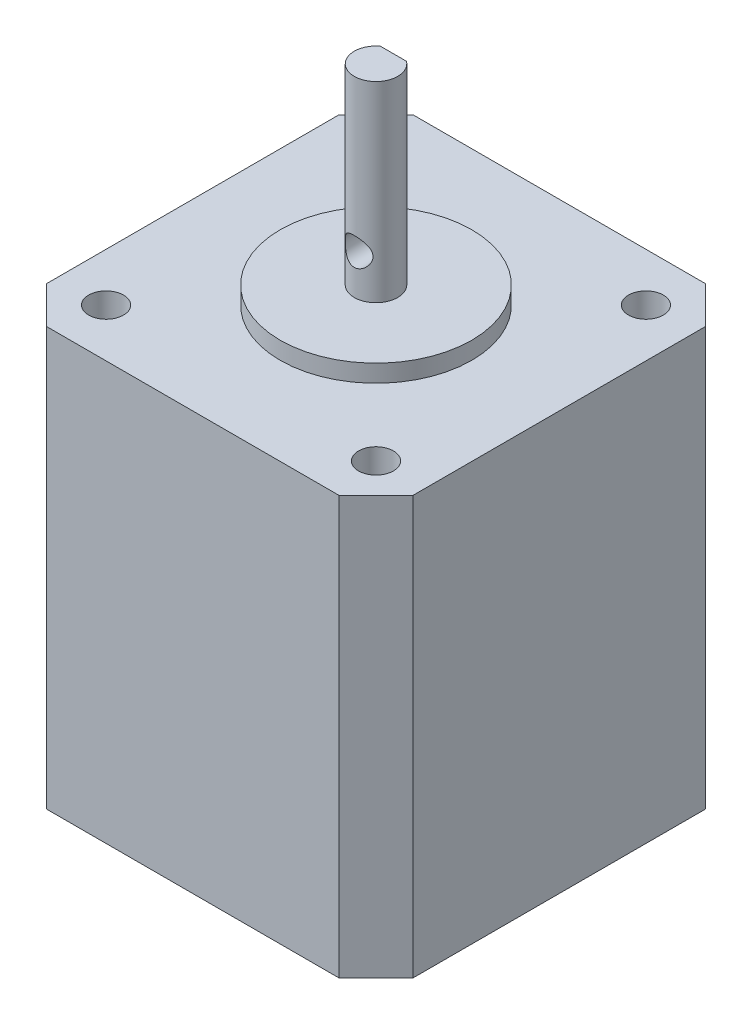
ISO-10303-21;
HEADER;
FILE_DESCRIPTION(('STEP AP214'),'2;1');
FILE_NAME('part.step','',(''),(''),'','','');
FILE_SCHEMA(('AUTOMOTIVE_DESIGN { 1 0 10303 214 1 1 1 1 }'));
ENDSEC;
DATA;
#1=APPLICATION_CONTEXT('core data for automotive mechanical design processes');
#2=APPLICATION_PROTOCOL_DEFINITION('international standard','automotive_design',2000,#1);
#3=PRODUCT_CONTEXT('',#1,'mechanical');
#4=PRODUCT('Part','Part','',(#3));
#5=PRODUCT_RELATED_PRODUCT_CATEGORY('part','',(#4));
#6=PRODUCT_DEFINITION_FORMATION('','',#4);
#7=PRODUCT_DEFINITION_CONTEXT('part definition',#1,'design');
#8=PRODUCT_DEFINITION('design','',#6,#7);
#9=PRODUCT_DEFINITION_SHAPE('','',#8);
#10=(LENGTH_UNIT() NAMED_UNIT(*) SI_UNIT(.MILLI.,.METRE.));
#11=(NAMED_UNIT(*) PLANE_ANGLE_UNIT() SI_UNIT($,.RADIAN.));
#12=(NAMED_UNIT(*) SI_UNIT($,.STERADIAN.) SOLID_ANGLE_UNIT());
#13=UNCERTAINTY_MEASURE_WITH_UNIT(LENGTH_MEASURE(1.E-05),#10,'distance_accuracy_value','');
#14=(GEOMETRIC_REPRESENTATION_CONTEXT(3) GLOBAL_UNCERTAINTY_ASSIGNED_CONTEXT((#13)) GLOBAL_UNIT_ASSIGNED_CONTEXT((#10,
#11,#12)) REPRESENTATION_CONTEXT('',''));
#15=CARTESIAN_POINT('',(0.,0.,0.));
#16=DIRECTION('',(0.,0.,1.));
#17=DIRECTION('',(1.,0.,0.));
#18=AXIS2_PLACEMENT_3D('',#15,#16,#17);
#19=CARTESIAN_POINT('',(-16.8073593128807,48.,-21.05));
#20=DIRECTION('',(0.707106781186548,0.,0.707106781186547));
#21=DIRECTION('',(0.707106781186547,0.,-0.707106781186548));
#22=AXIS2_PLACEMENT_3D('',#19,#20,#21);
#23=PLANE('',#22);
#24=DIRECTION('',(-0.707106781186547,0.,0.707106781186548));
#25=VECTOR('',#24,1.);
#26=CARTESIAN_POINT('',(-16.8073593128807,0.,-21.05));
#27=LINE('',#26,#25);
#28=CARTESIAN_POINT('',(-16.8073593128807,0.,-21.05));
#29=VERTEX_POINT('',#28);
#30=CARTESIAN_POINT('',(-21.05,0.,-16.8073593128807));
#31=VERTEX_POINT('',#30);
#32=EDGE_CURVE('E154',#29,#31,#27,.T.);
#33=ORIENTED_EDGE('',*,*,#32,.T.);
#34=DIRECTION('',(0.,-1.,0.));
#35=VECTOR('',#34,1.);
#36=CARTESIAN_POINT('',(-21.05,48.,-16.8073593128807));
#37=LINE('',#36,#35);
#38=CARTESIAN_POINT('',(-21.05,48.,-16.8073593128807));
#39=VERTEX_POINT('',#38);
#40=EDGE_CURVE('E185',#39,#31,#37,.T.);
#41=ORIENTED_EDGE('',*,*,#40,.F.);
#42=DIRECTION('',(-0.707106781186547,0.,0.707106781186548));
#43=VECTOR('',#42,1.);
#44=CARTESIAN_POINT('',(-16.8073593128807,48.,-21.05));
#45=LINE('',#44,#43);
#46=CARTESIAN_POINT('',(-16.8073593128807,48.,-21.05));
#47=VERTEX_POINT('',#46);
#48=EDGE_CURVE('E174',#47,#39,#45,.T.);
#49=ORIENTED_EDGE('',*,*,#48,.F.);
#50=DIRECTION('',(0.,-1.,0.));
#51=VECTOR('',#50,1.);
#52=CARTESIAN_POINT('',(-16.8073593128807,48.,-21.05));
#53=LINE('',#52,#51);
#54=EDGE_CURVE('E67',#47,#29,#53,.T.);
#55=ORIENTED_EDGE('',*,*,#54,.T.);
#56=EDGE_LOOP('',(#33,#41,#49,#55));
#57=FACE_BOUND('',#56,.T.);
#58=ADVANCED_FACE('F38',(#57),#23,.F.);
#59=CARTESIAN_POINT('',(-21.05,48.,-16.8073593128807));
#60=DIRECTION('',(1.,0.,0.));
#61=DIRECTION('',(0.,0.,-1.));
#62=AXIS2_PLACEMENT_3D('',#59,#60,#61);
#63=PLANE('',#62);
#64=DIRECTION('',(0.,0.,1.));
#65=VECTOR('',#64,1.);
#66=CARTESIAN_POINT('',(-21.05,0.,-16.8073593128807));
#67=LINE('',#66,#65);
#68=CARTESIAN_POINT('',(-21.05,0.,16.8073593128807));
#69=VERTEX_POINT('',#68);
#70=EDGE_CURVE('E156',#31,#69,#67,.T.);
#71=ORIENTED_EDGE('',*,*,#70,.T.);
#72=DIRECTION('',(0.,-1.,0.));
#73=VECTOR('',#72,1.);
#74=CARTESIAN_POINT('',(-21.05,48.,16.8073593128807));
#75=LINE('',#74,#73);
#76=CARTESIAN_POINT('',(-21.05,48.,16.8073593128807));
#77=VERTEX_POINT('',#76);
#78=EDGE_CURVE('E183',#77,#69,#75,.T.);
#79=ORIENTED_EDGE('',*,*,#78,.F.);
#80=DIRECTION('',(0.,0.,1.));
#81=VECTOR('',#80,1.);
#82=CARTESIAN_POINT('',(-21.05,48.,-16.8073593128807));
#83=LINE('',#82,#81);
#84=EDGE_CURVE('E107',#39,#77,#83,.T.);
#85=ORIENTED_EDGE('',*,*,#84,.F.);
#86=ORIENTED_EDGE('',*,*,#40,.T.);
#87=EDGE_LOOP('',(#71,#79,#85,#86));
#88=FACE_BOUND('',#87,.T.);
#89=ADVANCED_FACE('F220',(#88),#63,.F.);
#90=CARTESIAN_POINT('',(-16.8073593128807,48.,21.05));
#91=DIRECTION('',(-0.707106781186548,0.,0.707106781186547));
#92=DIRECTION('',(0.707106781186547,0.,0.707106781186548));
#93=AXIS2_PLACEMENT_3D('',#90,#91,#92);
#94=PLANE('',#93);
#95=DIRECTION('',(-0.707106781186547,0.,-0.707106781186548));
#96=VECTOR('',#95,1.);
#97=CARTESIAN_POINT('',(-16.8073593128807,0.,21.05));
#98=LINE('',#97,#96);
#99=CARTESIAN_POINT('',(-16.8073593128807,0.,21.05));
#100=VERTEX_POINT('',#99);
#101=EDGE_CURVE('E160',#100,#69,#98,.T.);
#102=ORIENTED_EDGE('',*,*,#101,.F.);
#103=DIRECTION('',(0.,-1.,0.));
#104=VECTOR('',#103,1.);
#105=CARTESIAN_POINT('',(-16.8073593128807,48.,21.05));
#106=LINE('',#105,#104);
#107=CARTESIAN_POINT('',(-16.8073593128807,48.,21.05));
#108=VERTEX_POINT('',#107);
#109=EDGE_CURVE('E181',#108,#100,#106,.T.);
#110=ORIENTED_EDGE('',*,*,#109,.F.);
#111=DIRECTION('',(-0.707106781186547,0.,-0.707106781186548));
#112=VECTOR('',#111,1.);
#113=CARTESIAN_POINT('',(-16.8073593128807,48.,21.05));
#114=LINE('',#113,#112);
#115=EDGE_CURVE('E242',#108,#77,#114,.T.);
#116=ORIENTED_EDGE('',*,*,#115,.T.);
#117=ORIENTED_EDGE('',*,*,#78,.T.);
#118=EDGE_LOOP('',(#102,#110,#116,#117));
#119=FACE_BOUND('',#118,.T.);
#120=ADVANCED_FACE('F224',(#119),#94,.T.);
#121=CARTESIAN_POINT('',(-16.8073593128807,48.,21.05));
#122=DIRECTION('',(0.,0.,-1.));
#123=DIRECTION('',(-1.,0.,0.));
#124=AXIS2_PLACEMENT_3D('',#121,#122,#123);
#125=PLANE('',#124);
#126=DIRECTION('',(1.,0.,0.));
#127=VECTOR('',#126,1.);
#128=CARTESIAN_POINT('',(-16.8073593128807,0.,21.05));
#129=LINE('',#128,#127);
#130=CARTESIAN_POINT('',(16.8073593128807,0.,21.05));
#131=VERTEX_POINT('',#130);
#132=EDGE_CURVE('E163',#100,#131,#129,.T.);
#133=ORIENTED_EDGE('',*,*,#132,.T.);
#134=DIRECTION('',(0.,-1.,0.));
#135=VECTOR('',#134,1.);
#136=CARTESIAN_POINT('',(16.8073593128807,48.,21.05));
#137=LINE('',#136,#135);
#138=CARTESIAN_POINT('',(16.8073593128807,48.,21.05));
#139=VERTEX_POINT('',#138);
#140=EDGE_CURVE('E178',#139,#131,#137,.T.);
#141=ORIENTED_EDGE('',*,*,#140,.F.);
#142=DIRECTION('',(1.,0.,0.));
#143=VECTOR('',#142,1.);
#144=CARTESIAN_POINT('',(-16.8073593128807,48.,21.05));
#145=LINE('',#144,#143);
#146=EDGE_CURVE('E238',#108,#139,#145,.T.);
#147=ORIENTED_EDGE('',*,*,#146,.F.);
#148=ORIENTED_EDGE('',*,*,#109,.T.);
#149=EDGE_LOOP('',(#133,#141,#147,#148));
#150=FACE_BOUND('',#149,.T.);
#151=ADVANCED_FACE('F237',(#150),#125,.F.);
#152=CARTESIAN_POINT('',(16.8073593128807,48.,21.05));
#153=DIRECTION('',(-0.707106781186548,0.,-0.707106781186547));
#154=DIRECTION('',(-0.707106781186547,0.,0.707106781186548));
#155=AXIS2_PLACEMENT_3D('',#152,#153,#154);
#156=PLANE('',#155);
#157=DIRECTION('',(0.707106781186547,0.,-0.707106781186548));
#158=VECTOR('',#157,1.);
#159=CARTESIAN_POINT('',(16.8073593128807,0.,21.05));
#160=LINE('',#159,#158);
#161=CARTESIAN_POINT('',(21.05,0.,16.8073593128807));
#162=VERTEX_POINT('',#161);
#163=EDGE_CURVE('E165',#131,#162,#160,.T.);
#164=ORIENTED_EDGE('',*,*,#163,.T.);
#165=DIRECTION('',(0.,-1.,0.));
#166=VECTOR('',#165,1.);
#167=CARTESIAN_POINT('',(21.05,48.,16.8073593128807));
#168=LINE('',#167,#166);
#169=CARTESIAN_POINT('',(21.05,48.,16.8073593128807));
#170=VERTEX_POINT('',#169);
#171=EDGE_CURVE('E136',#170,#162,#168,.T.);
#172=ORIENTED_EDGE('',*,*,#171,.F.);
#173=DIRECTION('',(0.707106781186547,0.,-0.707106781186548));
#174=VECTOR('',#173,1.);
#175=CARTESIAN_POINT('',(16.8073593128807,48.,21.05));
#176=LINE('',#175,#174);
#177=EDGE_CURVE('E145',#139,#170,#176,.T.);
#178=ORIENTED_EDGE('',*,*,#177,.F.);
#179=ORIENTED_EDGE('',*,*,#140,.T.);
#180=EDGE_LOOP('',(#164,#172,#178,#179));
#181=FACE_BOUND('',#180,.T.);
#182=ADVANCED_FACE('F233',(#181),#156,.F.);
#183=CARTESIAN_POINT('',(21.05,48.,-16.8073593128807));
#184=DIRECTION('',(1.,0.,0.));
#185=DIRECTION('',(0.,0.,-1.));
#186=AXIS2_PLACEMENT_3D('',#183,#184,#185);
#187=PLANE('',#186);
#188=DIRECTION('',(0.,0.,1.));
#189=VECTOR('',#188,1.);
#190=CARTESIAN_POINT('',(21.05,0.,-16.8073593128807));
#191=LINE('',#190,#189);
#192=CARTESIAN_POINT('',(21.05,0.,-16.8073593128807));
#193=VERTEX_POINT('',#192);
#194=EDGE_CURVE('E131',#193,#162,#191,.T.);
#195=ORIENTED_EDGE('',*,*,#194,.F.);
#196=DIRECTION('',(0.,-1.,0.));
#197=VECTOR('',#196,1.);
#198=CARTESIAN_POINT('',(21.05,48.,-16.8073593128807));
#199=LINE('',#198,#197);
#200=CARTESIAN_POINT('',(21.05,48.,-16.8073593128807));
#201=VERTEX_POINT('',#200);
#202=EDGE_CURVE('E126',#201,#193,#199,.T.);
#203=ORIENTED_EDGE('',*,*,#202,.F.);
#204=DIRECTION('',(0.,0.,1.));
#205=VECTOR('',#204,1.);
#206=CARTESIAN_POINT('',(21.05,48.,-16.8073593128807));
#207=LINE('',#206,#205);
#208=EDGE_CURVE('E129',#201,#170,#207,.T.);
#209=ORIENTED_EDGE('',*,*,#208,.T.);
#210=ORIENTED_EDGE('',*,*,#171,.T.);
#211=EDGE_LOOP('',(#195,#203,#209,#210));
#212=FACE_BOUND('',#211,.T.);
#213=ADVANCED_FACE('F128',(#212),#187,.T.);
#214=CARTESIAN_POINT('',(16.8073593128807,48.,-21.05));
#215=DIRECTION('',(0.707106781186548,0.,-0.707106781186547));
#216=DIRECTION('',(-0.707106781186547,0.,-0.707106781186548));
#217=AXIS2_PLACEMENT_3D('',#214,#215,#216);
#218=PLANE('',#217);
#219=DIRECTION('',(0.707106781186547,0.,0.707106781186548));
#220=VECTOR('',#219,1.);
#221=CARTESIAN_POINT('',(16.8073593128807,0.,-21.05));
#222=LINE('',#221,#220);
#223=CARTESIAN_POINT('',(16.8073593128807,0.,-21.05));
#224=VERTEX_POINT('',#223);
#225=EDGE_CURVE('E169',#224,#193,#222,.T.);
#226=ORIENTED_EDGE('',*,*,#225,.F.);
#227=DIRECTION('',(0.,-1.,0.));
#228=VECTOR('',#227,1.);
#229=CARTESIAN_POINT('',(16.8073593128807,48.,-21.05));
#230=LINE('',#229,#228);
#231=CARTESIAN_POINT('',(16.8073593128807,48.,-21.05));
#232=VERTEX_POINT('',#231);
#233=EDGE_CURVE('E137',#232,#224,#230,.T.);
#234=ORIENTED_EDGE('',*,*,#233,.F.);
#235=DIRECTION('',(0.707106781186547,0.,0.707106781186548));
#236=VECTOR('',#235,1.);
#237=CARTESIAN_POINT('',(16.8073593128807,48.,-21.05));
#238=LINE('',#237,#236);
#239=EDGE_CURVE('E143',#232,#201,#238,.T.);
#240=ORIENTED_EDGE('',*,*,#239,.T.);
#241=ORIENTED_EDGE('',*,*,#202,.T.);
#242=EDGE_LOOP('',(#226,#234,#240,#241));
#243=FACE_BOUND('',#242,.T.);
#244=ADVANCED_FACE('F148',(#243),#218,.T.);
#245=CARTESIAN_POINT('',(-16.8073593128807,48.,-21.05));
#246=DIRECTION('',(0.,0.,-1.));
#247=DIRECTION('',(-1.,0.,0.));
#248=AXIS2_PLACEMENT_3D('',#245,#246,#247);
#249=PLANE('',#248);
#250=DIRECTION('',(1.,0.,0.));
#251=VECTOR('',#250,1.);
#252=CARTESIAN_POINT('',(-16.8073593128807,0.,-21.05));
#253=LINE('',#252,#251);
#254=EDGE_CURVE('E171',#29,#224,#253,.T.);
#255=ORIENTED_EDGE('',*,*,#254,.F.);
#256=ORIENTED_EDGE('',*,*,#54,.F.);
#257=DIRECTION('',(1.,0.,0.));
#258=VECTOR('',#257,1.);
#259=CARTESIAN_POINT('',(-16.8073593128807,48.,-21.05));
#260=LINE('',#259,#258);
#261=EDGE_CURVE('E149',#47,#232,#260,.T.);
#262=ORIENTED_EDGE('',*,*,#261,.T.);
#263=ORIENTED_EDGE('',*,*,#233,.T.);
#264=EDGE_LOOP('',(#255,#256,#262,#263));
#265=FACE_BOUND('',#264,.T.);
#266=ADVANCED_FACE('F228',(#265),#249,.T.);
#267=CARTESIAN_POINT('',(0.,48.,0.));
#268=DIRECTION('',(0.,-1.,0.));
#269=DIRECTION('',(0.,0.,-1.));
#270=AXIS2_PLACEMENT_3D('',#267,#268,#269);
#271=PLANE('',#270);
#272=CARTESIAN_POINT('',(0.,48.,0.));
#273=DIRECTION('',(0.,-1.,0.));
#274=DIRECTION('',(0.,0.,-1.));
#275=AXIS2_PLACEMENT_3D('',#272,#273,#274);
#276=CIRCLE('',#275,11.);
#277=CARTESIAN_POINT('',(0.,48.,-11.));
#278=VERTEX_POINT('',#277);
#279=EDGE_CURVE('E187',#278,#278,#276,.F.);
#280=ORIENTED_EDGE('',*,*,#279,.F.);
#281=EDGE_LOOP('',(#280));
#282=FACE_BOUND('',#281,.T.);
#283=CARTESIAN_POINT('',(-15.5,48.,15.5));
#284=DIRECTION('',(0.,1.,0.));
#285=DIRECTION('',(0.,0.,-1.));
#286=AXIS2_PLACEMENT_3D('',#283,#284,#285);
#287=CIRCLE('',#286,2.);
#288=CARTESIAN_POINT('',(-15.5,48.,13.5));
#289=VERTEX_POINT('',#288);
#290=EDGE_CURVE('E258',#289,#289,#287,.T.);
#291=ORIENTED_EDGE('',*,*,#290,.F.);
#292=EDGE_LOOP('',(#291));
#293=FACE_BOUND('',#292,.T.);
#294=CARTESIAN_POINT('',(15.5,48.,15.5));
#295=DIRECTION('',(0.,1.,0.));
#296=DIRECTION('',(0.,0.,1.));
#297=AXIS2_PLACEMENT_3D('',#294,#295,#296);
#298=CIRCLE('',#297,2.);
#299=CARTESIAN_POINT('',(15.5,48.,17.5));
#300=VERTEX_POINT('',#299);
#301=EDGE_CURVE('E257',#300,#300,#298,.T.);
#302=ORIENTED_EDGE('',*,*,#301,.F.);
#303=EDGE_LOOP('',(#302));
#304=FACE_BOUND('',#303,.T.);
#305=CARTESIAN_POINT('',(15.5,48.,-15.5));
#306=DIRECTION('',(0.,1.,0.));
#307=DIRECTION('',(0.,0.,-1.));
#308=AXIS2_PLACEMENT_3D('',#305,#306,#307);
#309=CIRCLE('',#308,2.);
#310=CARTESIAN_POINT('',(15.5,48.,-17.5));
#311=VERTEX_POINT('',#310);
#312=EDGE_CURVE('E265',#311,#311,#309,.T.);
#313=ORIENTED_EDGE('',*,*,#312,.F.);
#314=EDGE_LOOP('',(#313));
#315=FACE_BOUND('',#314,.T.);
#316=CARTESIAN_POINT('',(-15.5,48.,-15.5));
#317=DIRECTION('',(0.,1.,0.));
#318=DIRECTION('',(0.,0.,1.));
#319=AXIS2_PLACEMENT_3D('',#316,#317,#318);
#320=CIRCLE('',#319,2.);
#321=CARTESIAN_POINT('',(-15.5,48.,-13.5));
#322=VERTEX_POINT('',#321);
#323=EDGE_CURVE('E250',#322,#322,#320,.T.);
#324=ORIENTED_EDGE('',*,*,#323,.F.);
#325=EDGE_LOOP('',(#324));
#326=FACE_BOUND('',#325,.T.);
#327=ORIENTED_EDGE('',*,*,#48,.T.);
#328=ORIENTED_EDGE('',*,*,#84,.T.);
#329=ORIENTED_EDGE('',*,*,#115,.F.);
#330=ORIENTED_EDGE('',*,*,#146,.T.);
#331=ORIENTED_EDGE('',*,*,#177,.T.);
#332=ORIENTED_EDGE('',*,*,#208,.F.);
#333=ORIENTED_EDGE('',*,*,#239,.F.);
#334=ORIENTED_EDGE('',*,*,#261,.F.);
#335=EDGE_LOOP('',(#327,#328,#329,#330,#331,#332,#333,#334));
#336=FACE_BOUND('',#335,.T.);
#337=ADVANCED_FACE('F141',(#282,#293,#304,#315,#326,#336),#271,.F.);
#338=CARTESIAN_POINT('',(0.,0.,0.));
#339=DIRECTION('',(0.,-1.,0.));
#340=DIRECTION('',(0.,0.,-1.));
#341=AXIS2_PLACEMENT_3D('',#338,#339,#340);
#342=PLANE('',#341);
#343=CARTESIAN_POINT('',(0.,0.,0.));
#344=DIRECTION('',(0.,-1.,0.));
#345=DIRECTION('',(0.,0.,-1.));
#346=AXIS2_PLACEMENT_3D('',#343,#344,#345);
#347=CIRCLE('',#346,2.5);
#348=CARTESIAN_POINT('',(0.,0.,-2.5));
#349=VERTEX_POINT('',#348);
#350=EDGE_CURVE('E291',#349,#349,#347,.T.);
#351=ORIENTED_EDGE('',*,*,#350,.F.);
#352=EDGE_LOOP('',(#351));
#353=FACE_BOUND('',#352,.T.);
#354=CARTESIAN_POINT('',(-15.5,0.,15.5));
#355=DIRECTION('',(0.,-1.,0.));
#356=DIRECTION('',(0.,0.,-1.));
#357=AXIS2_PLACEMENT_3D('',#354,#355,#356);
#358=CIRCLE('',#357,2.);
#359=CARTESIAN_POINT('',(-15.5,0.,13.5));
#360=VERTEX_POINT('',#359);
#361=EDGE_CURVE('E254',#360,#360,#358,.F.);
#362=ORIENTED_EDGE('',*,*,#361,.T.);
#363=EDGE_LOOP('',(#362));
#364=FACE_BOUND('',#363,.T.);
#365=CARTESIAN_POINT('',(15.5,0.,15.5));
#366=DIRECTION('',(0.,-1.,0.));
#367=DIRECTION('',(0.,0.,-1.));
#368=AXIS2_PLACEMENT_3D('',#365,#366,#367);
#369=CIRCLE('',#368,2.);
#370=CARTESIAN_POINT('',(15.5,0.,13.5));
#371=VERTEX_POINT('',#370);
#372=EDGE_CURVE('E262',#371,#371,#369,.F.);
#373=ORIENTED_EDGE('',*,*,#372,.T.);
#374=EDGE_LOOP('',(#373));
#375=FACE_BOUND('',#374,.T.);
#376=CARTESIAN_POINT('',(15.5,0.,-15.5));
#377=DIRECTION('',(0.,-1.,0.));
#378=DIRECTION('',(0.,0.,-1.));
#379=AXIS2_PLACEMENT_3D('',#376,#377,#378);
#380=CIRCLE('',#379,2.);
#381=CARTESIAN_POINT('',(15.5,0.,-17.5));
#382=VERTEX_POINT('',#381);
#383=EDGE_CURVE('E253',#382,#382,#380,.F.);
#384=ORIENTED_EDGE('',*,*,#383,.T.);
#385=EDGE_LOOP('',(#384));
#386=FACE_BOUND('',#385,.T.);
#387=CARTESIAN_POINT('',(-15.5,0.,-15.5));
#388=DIRECTION('',(0.,-1.,0.));
#389=DIRECTION('',(0.,0.,-1.));
#390=AXIS2_PLACEMENT_3D('',#387,#388,#389);
#391=CIRCLE('',#390,2.);
#392=CARTESIAN_POINT('',(-15.5,0.,-17.5));
#393=VERTEX_POINT('',#392);
#394=EDGE_CURVE('E157',#393,#393,#391,.F.);
#395=ORIENTED_EDGE('',*,*,#394,.T.);
#396=EDGE_LOOP('',(#395));
#397=FACE_BOUND('',#396,.T.);
#398=ORIENTED_EDGE('',*,*,#32,.F.);
#399=ORIENTED_EDGE('',*,*,#254,.T.);
#400=ORIENTED_EDGE('',*,*,#225,.T.);
#401=ORIENTED_EDGE('',*,*,#194,.T.);
#402=ORIENTED_EDGE('',*,*,#163,.F.);
#403=ORIENTED_EDGE('',*,*,#132,.F.);
#404=ORIENTED_EDGE('',*,*,#101,.T.);
#405=ORIENTED_EDGE('',*,*,#70,.F.);
#406=EDGE_LOOP('',(#398,#399,#400,#401,#402,#403,#404,#405));
#407=FACE_BOUND('',#406,.T.);
#408=ADVANCED_FACE('F227',(#353,#364,#375,#386,#397,#407),#342,.T.);
#409=CARTESIAN_POINT('',(-15.5,-5.65685424949239,-15.5));
#410=DIRECTION('',(0.,1.,0.));
#411=DIRECTION('',(0.,0.,1.));
#412=AXIS2_PLACEMENT_3D('',#409,#410,#411);
#413=CYLINDRICAL_SURFACE('',#412,2.);
#414=ORIENTED_EDGE('',*,*,#323,.T.);
#415=EDGE_LOOP('',(#414));
#416=FACE_BOUND('',#415,.T.);
#417=ORIENTED_EDGE('',*,*,#394,.F.);
#418=EDGE_LOOP('',(#417));
#419=FACE_BOUND('',#418,.T.);
#420=ADVANCED_FACE('F317',(#416,#419),#413,.F.);
#421=CARTESIAN_POINT('',(15.5,-5.65685424949239,-15.5));
#422=DIRECTION('',(0.,1.,0.));
#423=DIRECTION('',(0.,0.,1.));
#424=AXIS2_PLACEMENT_3D('',#421,#422,#423);
#425=CYLINDRICAL_SURFACE('',#424,2.);
#426=ORIENTED_EDGE('',*,*,#312,.T.);
#427=EDGE_LOOP('',(#426));
#428=FACE_BOUND('',#427,.T.);
#429=ORIENTED_EDGE('',*,*,#383,.F.);
#430=EDGE_LOOP('',(#429));
#431=FACE_BOUND('',#430,.T.);
#432=ADVANCED_FACE('F328',(#428,#431),#425,.F.);
#433=CARTESIAN_POINT('',(15.5,-5.65685424949239,15.5));
#434=DIRECTION('',(0.,1.,0.));
#435=DIRECTION('',(0.,0.,1.));
#436=AXIS2_PLACEMENT_3D('',#433,#434,#435);
#437=CYLINDRICAL_SURFACE('',#436,2.);
#438=ORIENTED_EDGE('',*,*,#301,.T.);
#439=EDGE_LOOP('',(#438));
#440=FACE_BOUND('',#439,.T.);
#441=ORIENTED_EDGE('',*,*,#372,.F.);
#442=EDGE_LOOP('',(#441));
#443=FACE_BOUND('',#442,.T.);
#444=ADVANCED_FACE('F334',(#440,#443),#437,.F.);
#445=CARTESIAN_POINT('',(-15.5,-5.65685424949239,15.5));
#446=DIRECTION('',(0.,1.,0.));
#447=DIRECTION('',(0.,0.,1.));
#448=AXIS2_PLACEMENT_3D('',#445,#446,#447);
#449=CYLINDRICAL_SURFACE('',#448,2.);
#450=ORIENTED_EDGE('',*,*,#290,.T.);
#451=EDGE_LOOP('',(#450));
#452=FACE_BOUND('',#451,.T.);
#453=ORIENTED_EDGE('',*,*,#361,.F.);
#454=EDGE_LOOP('',(#453));
#455=FACE_BOUND('',#454,.T.);
#456=ADVANCED_FACE('F339',(#452,#455),#449,.F.);
#457=CARTESIAN_POINT('',(0.,50.,0.));
#458=DIRECTION('',(0.,-1.,0.));
#459=DIRECTION('',(0.,0.,-1.));
#460=AXIS2_PLACEMENT_3D('',#457,#458,#459);
#461=CYLINDRICAL_SURFACE('',#460,11.);
#462=CARTESIAN_POINT('',(0.,50.,0.));
#463=DIRECTION('',(0.,1.,0.));
#464=DIRECTION('',(0.,0.,1.));
#465=AXIS2_PLACEMENT_3D('',#462,#463,#464);
#466=CIRCLE('',#465,11.);
#467=CARTESIAN_POINT('',(0.,50.,11.));
#468=VERTEX_POINT('',#467);
#469=EDGE_CURVE('E261',#468,#468,#466,.T.);
#470=ORIENTED_EDGE('',*,*,#469,.F.);
#471=EDGE_LOOP('',(#470));
#472=FACE_BOUND('',#471,.T.);
#473=ORIENTED_EDGE('',*,*,#279,.T.);
#474=EDGE_LOOP('',(#473));
#475=FACE_BOUND('',#474,.T.);
#476=ADVANCED_FACE('F450',(#472,#475),#461,.T.);
#477=CARTESIAN_POINT('',(0.,50.,0.));
#478=DIRECTION('',(0.,1.,0.));
#479=DIRECTION('',(0.,0.,1.));
#480=AXIS2_PLACEMENT_3D('',#477,#478,#479);
#481=PLANE('',#480);
#482=CARTESIAN_POINT('',(0.,50.,0.));
#483=DIRECTION('',(0.,1.,0.));
#484=DIRECTION('',(0.,0.,1.));
#485=AXIS2_PLACEMENT_3D('',#482,#483,#484);
#486=CIRCLE('',#485,2.5);
#487=CARTESIAN_POINT('',(0.,50.,2.5));
#488=VERTEX_POINT('',#487);
#489=EDGE_CURVE('E51',#488,#488,#486,.T.);
#490=ORIENTED_EDGE('',*,*,#489,.F.);
#491=EDGE_LOOP('',(#490));
#492=FACE_BOUND('',#491,.T.);
#493=ORIENTED_EDGE('',*,*,#469,.T.);
#494=EDGE_LOOP('',(#493));
#495=FACE_BOUND('',#494,.T.);
#496=ADVANCED_FACE('F217',(#492,#495),#481,.T.);
#497=CARTESIAN_POINT('',(0.,72.,0.));
#498=DIRECTION('',(0.,-1.,0.));
#499=DIRECTION('',(0.,0.,-1.));
#500=AXIS2_PLACEMENT_3D('',#497,#498,#499);
#501=CYLINDRICAL_SURFACE('',#500,2.5);
#502=CARTESIAN_POINT('',(-1.58749999999999,54.5875,1.93128033956751));
#503=CARTESIAN_POINT('',(-1.58749244358328,54.6660610675195,1.93129254537125));
#504=CARTESIAN_POINT('',(-1.58161469369597,54.7447315152789,1.93616460552828));
#505=CARTESIAN_POINT('',(-1.55853768331778,54.8993827799762,1.95477910431798));
#506=CARTESIAN_POINT('',(-1.54130977786983,54.9753562778777,1.96854398449826));
#507=CARTESIAN_POINT('',(-1.49679109964581,55.1219063938072,2.00259480388706));
#508=CARTESIAN_POINT('',(-1.4695900367067,55.1925245514409,2.0228224076485));
#509=CARTESIAN_POINT('',(-1.40615710600826,55.3280992341618,2.06741943982204));
#510=CARTESIAN_POINT('',(-1.36992450777294,55.393055300722,2.09178920320375));
#511=CARTESIAN_POINT('',(-1.2835901593372,55.5253868138217,2.14600536157898));
#512=CARTESIAN_POINT('',(-1.23226037590958,55.5918424200717,2.17614206726941));
#513=CARTESIAN_POINT('',(-1.11969151289097,55.7159837146109,2.23615011857725));
#514=CARTESIAN_POINT('',(-1.0584436977564,55.7736615840245,2.26602120555179));
#515=CARTESIAN_POINT('',(-0.918441436207442,55.885822590982,2.3265820961241));
#516=CARTESIAN_POINT('',(-0.838453444075763,55.9389868089125,2.35690056370684));
#517=CARTESIAN_POINT('',(-0.668374404400185,56.0306678908315,2.41064281726253));
#518=CARTESIAN_POINT('',(-0.578293764481816,56.0691996671261,2.43407361710548));
#519=CARTESIAN_POINT('',(-0.400482455501669,56.1261856730119,2.46920037947961));
#520=CARTESIAN_POINT('',(-0.313484526170512,56.1463132838778,2.48186451837758));
#521=CARTESIAN_POINT('',(-0.136531355354793,56.1716329067382,2.49784287985026));
#522=CARTESIAN_POINT('',(-0.046579472382031,56.1768413244873,2.50116737260421));
#523=CARTESIAN_POINT('',(0.120260556312748,56.1723270519165,2.49830436351348));
#524=CARTESIAN_POINT('',(0.197233752096306,56.1645710419817,2.49336962977317));
#525=CARTESIAN_POINT('',(0.348526852800659,56.1381710129326,2.47675565658899));
#526=CARTESIAN_POINT('',(0.422846557211728,56.1195261728493,2.46507590860205));
#527=CARTESIAN_POINT('',(0.567076080218005,56.0722068604793,2.43594982047985));
#528=CARTESIAN_POINT('',(0.636980794967767,56.0435210222867,2.4184969466924));
#529=CARTESIAN_POINT('',(0.771025844791173,55.9772024893936,2.37916053438288));
#530=CARTESIAN_POINT('',(0.835164931683156,55.9395678637971,2.35727603979334));
#531=CARTESIAN_POINT('',(0.964552022812143,55.8511024315496,2.30760189014917));
#532=CARTESIAN_POINT('',(1.02891728189111,55.7992053626904,2.27941551614367));
#533=CARTESIAN_POINT('',(1.14858978119194,55.6864413043536,2.22152472210105));
#534=CARTESIAN_POINT('',(1.20388331412292,55.6255610001638,2.19181809222002));
#535=CARTESIAN_POINT('',(1.31153281470526,55.4868172148956,2.12937879388882));
#536=CARTESIAN_POINT('',(1.36245704220605,55.4077698568165,2.09678671901756));
#537=CARTESIAN_POINT('',(1.45013830127312,55.2402992378839,2.03713483267683));
#538=CARTESIAN_POINT('',(1.48692115155699,55.1518934434096,2.01006498180941));
#539=CARTESIAN_POINT('',(1.53663204920112,54.9923456383093,1.97217258018503));
#540=CARTESIAN_POINT('',(1.55331448405983,54.9229500330814,1.95893868490424));
#541=CARTESIAN_POINT('',(1.57721243947511,54.7816028206997,1.93975355183642));
#542=CARTESIAN_POINT('',(1.58444171155429,54.7096550830952,1.93379173620066));
#543=CARTESIAN_POINT('',(1.5889930357064,54.5650291082328,1.93005504119756));
#544=CARTESIAN_POINT('',(1.58628815569306,54.4923494186711,1.93230241735562));
#545=CARTESIAN_POINT('',(1.57109847583128,54.348682510208,1.94466929360534));
#546=CARTESIAN_POINT('',(1.55860550502072,54.2776967564213,1.95479537067805));
#547=CARTESIAN_POINT('',(1.52497173470895,54.1408782191618,1.98113553338454));
#548=CARTESIAN_POINT('',(1.50404062529437,54.0749636281331,1.99720126654345));
#549=CARTESIAN_POINT('',(1.45436603907593,53.9474501439593,2.0336584455047));
#550=CARTESIAN_POINT('',(1.42561983084663,53.8858527691934,2.05405140315079));
#551=CARTESIAN_POINT('',(1.35473866261383,53.7560449614467,2.10162683757919));
#552=CARTESIAN_POINT('',(1.31108897670714,53.6888637256724,2.12935936903558));
#553=CARTESIAN_POINT('',(1.21446650814306,53.5620275172487,2.1859122928335));
#554=CARTESIAN_POINT('',(1.16148386606485,53.5023806195105,2.21473381004385));
#555=CARTESIAN_POINT('',(1.0368666734766,53.3817527758569,2.27607630358411));
#556=CARTESIAN_POINT('',(0.963590953936902,53.3223330358845,2.30837246841968));
#557=CARTESIAN_POINT('',(0.806215263610653,53.2166830940394,2.36792798904166));
#558=CARTESIAN_POINT('',(0.722119274754058,53.1704480601408,2.39518918878441));
#559=CARTESIAN_POINT('',(0.549692286593118,53.0954030327022,2.44035830531412));
#560=CARTESIAN_POINT('',(0.461821156400264,53.0658001601879,2.45868496994334));
#561=CARTESIAN_POINT('',(0.280907067047861,53.0222952604175,2.4858428042956));
#562=CARTESIAN_POINT('',(0.187872043312263,53.0083698060339,2.49468814123549));
#563=CARTESIAN_POINT('',(0.0148064463854588,52.998074239151,2.50122206835902));
#564=CARTESIAN_POINT('',(-0.0650365383692854,52.9993446454969,2.50041025919215));
#565=CARTESIAN_POINT('',(-0.223196799236508,53.01376564359,2.49127498172332));
#566=CARTESIAN_POINT('',(-0.301514190642558,53.0269153339986,2.48295208332397));
#567=CARTESIAN_POINT('',(-0.451040705303508,53.0635592957311,2.46009061329747));
#568=CARTESIAN_POINT('',(-0.522410685752092,53.0865841106759,2.44583490134196));
#569=CARTESIAN_POINT('',(-0.660183383572832,53.1418761782954,2.4122996448474));
#570=CARTESIAN_POINT('',(-0.726585335872273,53.1741448508378,2.3930193285642));
#571=CARTESIAN_POINT('',(-0.85981830398764,53.2505818080093,2.34864377644851));
#572=CARTESIAN_POINT('',(-0.926016620077456,53.2956222283895,2.32315810942894));
#573=CARTESIAN_POINT('',(-1.0503681981636,53.3945180030376,2.26965182233846));
#574=CARTESIAN_POINT('',(-1.10851254396723,53.4483829849034,2.24162844873264));
#575=CARTESIAN_POINT('',(-1.22416786369974,53.5726975379049,2.18089156327832));
#576=CARTESIAN_POINT('',(-1.28027518774973,53.6444228446325,2.14810513809684));
#577=CARTESIAN_POINT('',(-1.37990451144667,53.797352132897,2.08550372038001));
#578=CARTESIAN_POINT('',(-1.42343169408236,53.8785521914473,2.05568750745169));
#579=CARTESIAN_POINT('',(-1.48845773424906,54.0307755309642,2.0089146836728));
#580=CARTESIAN_POINT('',(-1.51268427417779,54.1002056754824,1.99057150679739));
#581=CARTESIAN_POINT('',(-1.55142234607457,54.2430035966726,1.96053600125636));
#582=CARTESIAN_POINT('',(-1.56596341847809,54.3163586561247,1.94882346585287));
#583=CARTESIAN_POINT('',(-1.57932151582951,54.4232443590633,1.93797990848114));
#584=CARTESIAN_POINT('',(-1.582382344573,54.4559604202981,1.93547778587683));
#585=CARTESIAN_POINT('',(-1.58647344829053,54.5216112009098,1.93212521629297));
#586=CARTESIAN_POINT('',(-1.58750316969123,54.5545459774437,1.93127521959722));
#587=CARTESIAN_POINT('',(-1.58749999999999,54.5875,1.93128033956751));
#588=B_SPLINE_CURVE_WITH_KNOTS('',3,(#502,#503,#504,#505,#506,#507,#508,#509,#510,#511,#512,
#513,#514,#515,#516,#517,#518,#519,#520,#521,#522,#523,#524,#525,#526,#527,#528,#529,#530,#531,
#532,#533,#534,#535,#536,#537,#538,#539,#540,#541,#542,#543,#544,#545,#546,#547,#548,#549,#550,
#551,#552,#553,#554,#555,#556,#557,#558,#559,#560,#561,#562,#563,#564,#565,#566,#567,#568,#569,
#570,#571,#572,#573,#574,#575,#576,#577,#578,#579,#580,#581,#582,#583,#584,#585,#586,#587),
.UNSPECIFIED.,.T.,.F.,(4,2,2,2,2,2,2,2,2,2,2,2,2,2,2,2,2,2,2,2,2,2,2,2,2,2,2,2,2,2,2,2,2,2,2,2,
2,2,2,2,2,2,4),(0.,0.23553199093703,0.471660694601698,0.705715509617022,0.939789261271601,
1.20641599269988,1.47327885224277,1.77377680968661,2.07396769460824,2.34288703426458,
2.61151054548611,2.84295696145303,3.07442082969481,3.30614755524941,3.53792432634556,
3.79896950582844,4.06040556006243,4.35753516756992,4.65411968280928,4.87098926120763,
5.08754300701437,5.3046842759417,5.52200700476705,5.73423284276679,5.94653295058107,
6.19994367548199,6.45362372908523,6.75128001522906,7.04882707354705,7.33062252112025,
7.61199631399688,7.85033060864155,8.08864682123257,8.3167086745513,8.54480557724492,
8.79591686962119,9.04730397154754,9.33640464984138,9.62538604898718,9.85191439874993,
10.0777486397874,10.17652036242,10.2753190013279),.UNSPECIFIED.);
#589=CARTESIAN_POINT('',(-1.58749999999999,54.5875,1.93128033956751));
#590=VERTEX_POINT('',#589);
#591=EDGE_CURVE('E41',#590,#590,#588,.T.);
#592=ORIENTED_EDGE('',*,*,#591,.T.);
#593=EDGE_LOOP('',(#592));
#594=FACE_BOUND('',#593,.T.);
#595=CARTESIAN_POINT('',(0.,56.175,-2.5));
#596=CARTESIAN_POINT('',(-0.0804275392077669,56.1749932796863,-2.49999381732176));
#597=CARTESIAN_POINT('',(-0.160945733373885,56.1688463012879,-2.49607842335397));
#598=CARTESIAN_POINT('',(-0.319495971129042,56.1445929365482,-2.48078563610083));
#599=CARTESIAN_POINT('',(-0.397523381347537,56.1264654847776,-2.46939509941875));
#600=CARTESIAN_POINT('',(-0.54849370718894,56.0793226650227,-2.44029448273674));
#601=CARTESIAN_POINT('',(-0.621459800427519,56.050361434301,-2.42261584611909));
#602=CARTESIAN_POINT('',(-0.761231628615219,55.9827479776817,-2.38239866072414));
#603=CARTESIAN_POINT('',(-0.828037851475217,55.9440965202308,-2.35986049733302));
#604=CARTESIAN_POINT('',(-0.959724818147456,55.8547496136582,-2.30960784788259));
#605=CARTESIAN_POINT('',(-1.0240093920166,55.8033313374128,-2.28162172707275));
#606=CARTESIAN_POINT('',(-1.14361862580517,55.6915854286322,-2.22408452236342));
#607=CARTESIAN_POINT('',(-1.19893077591869,55.6312455773249,-2.19453132841573));
#608=CARTESIAN_POINT('',(-1.30695465018877,55.4934460634152,-2.13219988859818));
#609=CARTESIAN_POINT('',(-1.35820554326521,55.4147721608991,-2.09955291754376));
#610=CARTESIAN_POINT('',(-1.44662545006464,55.2480276271845,-2.03964061089582));
#611=CARTESIAN_POINT('',(-1.4838185186063,55.159973381102,-2.0123661209262));
#612=CARTESIAN_POINT('',(-1.53439622304133,55.000756937622,-1.97391920592588));
#613=CARTESIAN_POINT('',(-1.55148386027163,54.9313437285284,-1.96039283759596));
#614=CARTESIAN_POINT('',(-1.57617722460559,54.7898807522266,-1.94059884572857));
#615=CARTESIAN_POINT('',(-1.58379701411306,54.7178350592415,-1.93432045789731));
#616=CARTESIAN_POINT('',(-1.58909258057533,54.5729088677014,-1.92997399750297));
#617=CARTESIAN_POINT('',(-1.58673923929302,54.5000265451103,-1.93192996642299));
#618=CARTESIAN_POINT('',(-1.57218636528281,54.3558903347022,-1.9437879043359));
#619=CARTESIAN_POINT('',(-1.55997878004727,54.2846378276939,-1.95369637176552));
#620=CARTESIAN_POINT('',(-1.52690348001931,54.1475389898419,-1.97964301791715));
#621=CARTESIAN_POINT('',(-1.50628206136311,54.0815980484937,-1.99550591552033));
#622=CARTESIAN_POINT('',(-1.45722510004142,53.9539940751819,-2.03160537081406));
#623=CARTESIAN_POINT('',(-1.42878694480061,53.8923324821434,-2.05184339031089));
#624=CARTESIAN_POINT('',(-1.35866140710162,53.762495474427,-2.09908233956329));
#625=CARTESIAN_POINT('',(-1.31548039372413,53.6953288417488,-2.1266364855915));
#626=CARTESIAN_POINT('',(-1.21983273150258,53.5684379506704,-2.18290959105901));
#627=CARTESIAN_POINT('',(-1.16735520435483,53.5087225523834,-2.21162988438172));
#628=CARTESIAN_POINT('',(-1.0437024423515,53.3876714304469,-2.27293787740996));
#629=CARTESIAN_POINT('',(-0.970861848209862,53.3279107759586,-2.30531321876883));
#630=CARTESIAN_POINT('',(-0.814364551255933,53.221524188131,-2.36512217293308));
#631=CARTESIAN_POINT('',(-0.730719736707133,53.1748839945352,-2.39256113915589));
#632=CARTESIAN_POINT('',(-0.571969226259647,53.1046041083698,-2.43479043934741));
#633=CARTESIAN_POINT('',(-0.498449853860065,53.0782391940572,-2.45100932965923));
#634=CARTESIAN_POINT('',(-0.347271419868866,53.0364698808447,-2.47694719929618));
#635=CARTESIAN_POINT('',(-0.26961569945027,53.0210567756255,-2.48667134135736));
#636=CARTESIAN_POINT('',(-0.112039239973579,53.0019653440847,-2.49874133488672));
#637=CARTESIAN_POINT('',(-0.0321120929578613,52.9983244266634,-2.50106366502119));
#638=CARTESIAN_POINT('',(0.127238173906786,53.0031009281299,-2.49803135595372));
#639=CARTESIAN_POINT('',(0.206661253643886,53.0115192948606,-2.49267611330523));
#640=CARTESIAN_POINT('',(0.358622611683484,53.0392057226287,-2.47526798635297));
#641=CARTESIAN_POINT('',(0.431306421515237,53.0579086026746,-2.46356439326453));
#642=CARTESIAN_POINT('',(0.572328835336822,53.1048926534122,-2.43467164363605));
#643=CARTESIAN_POINT('',(0.640666703687349,53.1331754406002,-2.41748156134401));
#644=CARTESIAN_POINT('',(0.776812304418726,53.2008018708507,-2.37738868686056));
#645=CARTESIAN_POINT('',(0.844181301134615,53.2408250770111,-2.35414996500365));
#646=CARTESIAN_POINT('',(0.971586611021317,53.3296381306312,-2.30449650181559));
#647=CARTESIAN_POINT('',(1.03161695979142,53.3784350302734,-2.27807921128408));
#648=CARTESIAN_POINT('',(1.15216359992318,53.4918169190568,-2.21983024417409));
#649=CARTESIAN_POINT('',(1.21138281374152,53.5576733925979,-2.18778358354619));
#650=CARTESIAN_POINT('',(1.31836288267159,53.6987303206598,-2.12503298008022));
#651=CARTESIAN_POINT('',(1.36612245932933,53.7739318163058,-2.09432918736663));
#652=CARTESIAN_POINT('',(1.44300384037446,53.9213378273058,-2.04195653334751));
#653=CARTESIAN_POINT('',(1.47381822941114,53.992418005882,-2.01962335267021));
#654=CARTESIAN_POINT('',(1.52505622358782,54.1398082615459,-1.98122055768616));
#655=CARTESIAN_POINT('',(1.5454944983101,54.2161107810802,-1.96514210810677));
#656=CARTESIAN_POINT('',(1.57497630965543,54.3729820664412,-1.94160362808463));
#657=CARTESIAN_POINT('',(1.58391703343065,54.4535827036885,-1.93422140912058));
#658=CARTESIAN_POINT('',(1.58931475859427,54.6154691699915,-1.92979204665562));
#659=CARTESIAN_POINT('',(1.58577904373811,54.6967545716363,-1.93273887304259));
#660=CARTESIAN_POINT('',(1.56787670941099,54.8459336573903,-1.94726939008552));
#661=CARTESIAN_POINT('',(1.55504686325411,54.9141463610682,-1.95762526432805));
#662=CARTESIAN_POINT('',(1.52101652599881,55.0472753046763,-1.9841806704164));
#663=CARTESIAN_POINT('',(1.49980804163089,55.1121883297534,-2.00038578118944));
#664=CARTESIAN_POINT('',(1.44115666560302,55.2594306376598,-2.04323082149419));
#665=CARTESIAN_POINT('',(1.4006375170337,55.3400469260828,-2.07154207714278));
#666=CARTESIAN_POINT('',(1.30737535500582,55.4924485763921,-2.13163128339619));
#667=CARTESIAN_POINT('',(1.25461598225932,55.5642219212008,-2.16341384310825));
#668=CARTESIAN_POINT('',(1.13725967925747,55.698733185909,-2.22736413683924));
#669=CARTESIAN_POINT('',(1.07254004053613,55.7613641444232,-2.25953229468485));
#670=CARTESIAN_POINT('',(0.932564180092608,55.8753795595972,-2.32081235001131));
#671=CARTESIAN_POINT('',(0.857308089687129,55.9267641564009,-2.34992428557421));
#672=CARTESIAN_POINT('',(0.695415554491913,56.0176540913547,-2.40286978321003));
#673=CARTESIAN_POINT('',(0.608547159324164,56.0568407085234,-2.42655802415929));
#674=CARTESIAN_POINT('',(0.472928634499449,56.1036757662254,-2.45529791620705));
#675=CARTESIAN_POINT('',(0.426875937075837,56.117290432204,-2.46374170277682));
#676=CARTESIAN_POINT('',(0.333367920850758,56.1403471210914,-2.4781232577164));
#677=CARTESIAN_POINT('',(0.285913630722395,56.1497921268585,-2.48406281740295));
#678=CARTESIAN_POINT('',(0.198749686065903,56.1630100847351,-2.49239942751169));
#679=CARTESIAN_POINT('',(0.159189551247473,56.1674994477548,-2.49524258992793));
#680=CARTESIAN_POINT('',(0.0797603846666172,56.1734961189413,-2.49904443911586));
#681=CARTESIAN_POINT('',(0.0398913432180047,56.1750033332158,-2.50000306655335));
#682=CARTESIAN_POINT('',(0.,56.175,-2.5));
#683=B_SPLINE_CURVE_WITH_KNOTS('',3,(#595,#596,#597,#598,#599,#600,#601,#602,#603,#604,#605,
#606,#607,#608,#609,#610,#611,#612,#613,#614,#615,#616,#617,#618,#619,#620,#621,#622,#623,#624,
#625,#626,#627,#628,#629,#630,#631,#632,#633,#634,#635,#636,#637,#638,#639,#640,#641,#642,#643,
#644,#645,#646,#647,#648,#649,#650,#651,#652,#653,#654,#655,#656,#657,#658,#659,#660,#661,#662,
#663,#664,#665,#666,#667,#668,#669,#670,#671,#672,#673,#674,#675,#676,#677,#678,#679,#680,#681,
#682),.UNSPECIFIED.,.T.,.F.,(4,2,2,2,2,2,2,2,2,2,2,2,2,2,2,2,2,2,2,2,2,2,2,2,2,2,2,2,2,2,2,2,2,
2,2,2,2,2,2,2,2,2,2,4),(0.,0.241122297868948,0.482669696344377,0.723025845987062,
0.963362941121116,1.22320295474432,1.48340219313014,1.78021095902281,2.07650952105311,
2.29387501655419,2.5109172760321,2.72859366289454,2.94644810677929,3.15833699079492,
3.37029678038642,3.62278371284674,3.8755680679497,4.17297909138429,4.47006560719468,
4.70835488925546,4.94645452678245,5.18531004219255,5.42418433234349,5.65108119227126,
5.87801635745407,6.12227587643682,6.36673261300121,6.64812590357084,6.9295505722094,
7.17050255317474,7.41111292480115,7.65386024242895,7.89646586741939,8.10611058603085,
8.31595579177405,8.5981617830888,8.88074714322467,9.16641129382375,9.45207188448282,
9.74466832254941,9.89073000768398,10.0366870343789,10.1562777816325,10.275872294116),.UNSPECIFIED.);
#684=CARTESIAN_POINT('',(0.,56.175,-2.5));
#685=VERTEX_POINT('',#684);
#686=EDGE_CURVE('E11',#685,#685,#683,.T.);
#687=ORIENTED_EDGE('',*,*,#686,.T.);
#688=EDGE_LOOP('',(#687));
#689=FACE_BOUND('',#688,.T.);
#690=CARTESIAN_POINT('',(0.,72.,0.));
#691=DIRECTION('',(0.,1.,0.));
#692=DIRECTION('',(0.,0.,1.));
#693=AXIS2_PLACEMENT_3D('',#690,#691,#692);
#694=CIRCLE('',#693,2.5);
#695=CARTESIAN_POINT('',(-1.5,72.,-2.));
#696=VERTEX_POINT('',#695);
#697=CARTESIAN_POINT('',(1.5,72.,-2.));
#698=VERTEX_POINT('',#697);
#699=EDGE_CURVE('E274',#696,#698,#694,.T.);
#700=ORIENTED_EDGE('',*,*,#699,.F.);
#701=DIRECTION('',(0.,1.,0.));
#702=VECTOR('',#701,1.);
#703=CARTESIAN_POINT('',(-1.5,57.,-2.));
#704=LINE('',#703,#702);
#705=CARTESIAN_POINT('',(-1.5,57.,-2.));
#706=VERTEX_POINT('',#705);
#707=EDGE_CURVE('E58',#706,#696,#704,.T.);
#708=ORIENTED_EDGE('',*,*,#707,.F.);
#709=CARTESIAN_POINT('',(0.,57.,0.));
#710=DIRECTION('',(0.,1.,0.));
#711=DIRECTION('',(0.,0.,1.));
#712=AXIS2_PLACEMENT_3D('',#709,#710,#711);
#713=CIRCLE('',#712,2.5);
#714=CARTESIAN_POINT('',(1.5,57.,-2.));
#715=VERTEX_POINT('',#714);
#716=EDGE_CURVE('E286',#715,#706,#713,.T.);
#717=ORIENTED_EDGE('',*,*,#716,.F.);
#718=DIRECTION('',(0.,1.,0.));
#719=VECTOR('',#718,1.);
#720=CARTESIAN_POINT('',(1.5,57.,-2.));
#721=LINE('',#720,#719);
#722=EDGE_CURVE('E279',#715,#698,#721,.T.);
#723=ORIENTED_EDGE('',*,*,#722,.T.);
#724=EDGE_LOOP('',(#700,#708,#717,#723));
#725=FACE_BOUND('',#724,.T.);
#726=ORIENTED_EDGE('',*,*,#489,.T.);
#727=EDGE_LOOP('',(#726));
#728=FACE_BOUND('',#727,.T.);
#729=ADVANCED_FACE('F192',(#594,#689,#725,#728),#501,.T.);
#730=CARTESIAN_POINT('',(0.,72.,0.));
#731=DIRECTION('',(0.,1.,0.));
#732=DIRECTION('',(0.,0.,1.));
#733=AXIS2_PLACEMENT_3D('',#730,#731,#732);
#734=PLANE('',#733);
#735=DIRECTION('',(1.,0.,0.));
#736=VECTOR('',#735,1.);
#737=CARTESIAN_POINT('',(-1.5,72.,-2.));
#738=LINE('',#737,#736);
#739=EDGE_CURVE('E284',#696,#698,#738,.T.);
#740=ORIENTED_EDGE('',*,*,#739,.F.);
#741=ORIENTED_EDGE('',*,*,#699,.T.);
#742=EDGE_LOOP('',(#740,#741));
#743=FACE_BOUND('',#742,.T.);
#744=ADVANCED_FACE('F211',(#743),#734,.T.);
#745=CARTESIAN_POINT('',(-1.5,57.,-2.));
#746=DIRECTION('',(0.,0.,1.));
#747=DIRECTION('',(1.,0.,0.));
#748=AXIS2_PLACEMENT_3D('',#745,#746,#747);
#749=PLANE('',#748);
#750=ORIENTED_EDGE('',*,*,#739,.T.);
#751=ORIENTED_EDGE('',*,*,#722,.F.);
#752=DIRECTION('',(1.,0.,0.));
#753=VECTOR('',#752,1.);
#754=CARTESIAN_POINT('',(-1.5,57.,-2.));
#755=LINE('',#754,#753);
#756=EDGE_CURVE('E281',#706,#715,#755,.T.);
#757=ORIENTED_EDGE('',*,*,#756,.F.);
#758=ORIENTED_EDGE('',*,*,#707,.T.);
#759=EDGE_LOOP('',(#750,#751,#757,#758));
#760=FACE_BOUND('',#759,.T.);
#761=ADVANCED_FACE('F208',(#760),#749,.F.);
#762=CARTESIAN_POINT('',(0.,57.,0.));
#763=DIRECTION('',(0.,1.,0.));
#764=DIRECTION('',(0.,0.,1.));
#765=AXIS2_PLACEMENT_3D('',#762,#763,#764);
#766=PLANE('',#765);
#767=ORIENTED_EDGE('',*,*,#716,.T.);
#768=ORIENTED_EDGE('',*,*,#756,.T.);
#769=EDGE_LOOP('',(#767,#768));
#770=FACE_BOUND('',#769,.T.);
#771=ADVANCED_FACE('F202',(#770),#766,.T.);
#772=CARTESIAN_POINT('',(0.,54.5875,21.05));
#773=DIRECTION('',(0.,0.,-1.));
#774=DIRECTION('',(-1.,0.,0.));
#775=AXIS2_PLACEMENT_3D('',#772,#773,#774);
#776=CYLINDRICAL_SURFACE('',#775,1.5875);
#777=ORIENTED_EDGE('',*,*,#591,.F.);
#778=EDGE_LOOP('',(#777));
#779=FACE_BOUND('',#778,.T.);
#780=ORIENTED_EDGE('',*,*,#686,.F.);
#781=EDGE_LOOP('',(#780));
#782=FACE_BOUND('',#781,.T.);
#783=ADVANCED_FACE('F196',(#779,#782),#776,.F.);
#784=CARTESIAN_POINT('',(0.,-10.,0.));
#785=DIRECTION('',(0.,1.,0.));
#786=DIRECTION('',(0.,0.,1.));
#787=AXIS2_PLACEMENT_3D('',#784,#785,#786);
#788=CYLINDRICAL_SURFACE('',#787,2.5);
#789=CARTESIAN_POINT('',(0.,-10.,0.));
#790=DIRECTION('',(0.,-1.,0.));
#791=DIRECTION('',(0.,0.,-1.));
#792=AXIS2_PLACEMENT_3D('',#789,#790,#791);
#793=CIRCLE('',#792,2.5);
#794=CARTESIAN_POINT('',(0.,-10.,-2.5));
#795=VERTEX_POINT('',#794);
#796=EDGE_CURVE('E294',#795,#795,#793,.T.);
#797=ORIENTED_EDGE('',*,*,#796,.F.);
#798=EDGE_LOOP('',(#797));
#799=FACE_BOUND('',#798,.T.);
#800=ORIENTED_EDGE('',*,*,#350,.T.);
#801=EDGE_LOOP('',(#800));
#802=FACE_BOUND('',#801,.T.);
#803=ADVANCED_FACE('F201',(#799,#802),#788,.T.);
#804=CARTESIAN_POINT('',(0.,-10.,0.));
#805=DIRECTION('',(0.,-1.,0.));
#806=DIRECTION('',(0.,0.,-1.));
#807=AXIS2_PLACEMENT_3D('',#804,#805,#806);
#808=PLANE('',#807);
#809=CARTESIAN_POINT('',(0.,-10.,0.));
#810=DIRECTION('',(0.,-1.,0.));
#811=DIRECTION('',(0.,0.,-1.));
#812=AXIS2_PLACEMENT_3D('',#809,#810,#811);
#813=CIRCLE('',#812,0.75);
#814=CARTESIAN_POINT('',(0.,-10.,-0.75));
#815=VERTEX_POINT('',#814);
#816=EDGE_CURVE('E300',#815,#815,#813,.T.);
#817=ORIENTED_EDGE('',*,*,#816,.F.);
#818=EDGE_LOOP('',(#817));
#819=FACE_BOUND('',#818,.T.);
#820=ORIENTED_EDGE('',*,*,#796,.T.);
#821=EDGE_LOOP('',(#820));
#822=FACE_BOUND('',#821,.T.);
#823=ADVANCED_FACE('F306',(#819,#822),#808,.T.);
#824=CARTESIAN_POINT('',(0.,2.12132034355964,0.));
#825=DIRECTION('',(0.,-1.,0.));
#826=DIRECTION('',(0.,0.,-1.));
#827=AXIS2_PLACEMENT_3D('',#824,#825,#826);
#828=CYLINDRICAL_SURFACE('',#827,0.75);
#829=CARTESIAN_POINT('',(0.,0.,0.));
#830=DIRECTION('',(0.,-1.,0.));
#831=DIRECTION('',(0.,0.,-1.));
#832=AXIS2_PLACEMENT_3D('',#829,#830,#831);
#833=CIRCLE('',#832,0.75);
#834=CARTESIAN_POINT('',(0.,0.,-0.75));
#835=VERTEX_POINT('',#834);
#836=EDGE_CURVE('E295',#835,#835,#833,.F.);
#837=CARTESIAN_POINT('',(0.,0.,-0.75));
#838=CARTESIAN_POINT('',(0.,-0.104166666666666,-0.75));
#839=CARTESIAN_POINT('',(0.,-0.208333333333333,-0.75));
#840=CARTESIAN_POINT('',(0.,-0.416666666666666,-0.75));
#841=CARTESIAN_POINT('',(0.,-0.520833333333333,-0.75));
#842=CARTESIAN_POINT('',(0.,-0.729166666666666,-0.75));
#843=CARTESIAN_POINT('',(0.,-0.833333333333333,-0.75));
#844=CARTESIAN_POINT('',(0.,-1.04166666666667,-0.75));
#845=CARTESIAN_POINT('',(0.,-1.14583333333333,-0.75));
#846=CARTESIAN_POINT('',(0.,-1.35416666666667,-0.75));
#847=CARTESIAN_POINT('',(0.,-1.45833333333333,-0.75));
#848=CARTESIAN_POINT('',(0.,-1.66666666666667,-0.75));
#849=CARTESIAN_POINT('',(0.,-1.77083333333333,-0.75));
#850=CARTESIAN_POINT('',(0.,-1.97916666666667,-0.75));
#851=CARTESIAN_POINT('',(0.,-2.08333333333333,-0.75));
#852=CARTESIAN_POINT('',(0.,-2.29166666666667,-0.75));
#853=CARTESIAN_POINT('',(0.,-2.39583333333333,-0.75));
#854=CARTESIAN_POINT('',(0.,-2.60416666666667,-0.75));
#855=CARTESIAN_POINT('',(0.,-2.70833333333333,-0.75));
#856=CARTESIAN_POINT('',(0.,-2.91666666666667,-0.75));
#857=CARTESIAN_POINT('',(0.,-3.02083333333333,-0.75));
#858=CARTESIAN_POINT('',(0.,-3.22916666666667,-0.75));
#859=CARTESIAN_POINT('',(0.,-3.33333333333333,-0.75));
#860=CARTESIAN_POINT('',(0.,-3.54166666666667,-0.75));
#861=CARTESIAN_POINT('',(0.,-3.64583333333333,-0.75));
#862=CARTESIAN_POINT('',(0.,-3.85416666666667,-0.75));
#863=CARTESIAN_POINT('',(0.,-3.95833333333333,-0.75));
#864=CARTESIAN_POINT('',(0.,-4.16666666666667,-0.75));
#865=CARTESIAN_POINT('',(0.,-4.27083333333333,-0.75));
#866=CARTESIAN_POINT('',(0.,-4.47916666666667,-0.75));
#867=CARTESIAN_POINT('',(0.,-4.58333333333333,-0.75));
#868=CARTESIAN_POINT('',(0.,-4.79166666666667,-0.75));
#869=CARTESIAN_POINT('',(0.,-4.89583333333333,-0.75));
#870=CARTESIAN_POINT('',(0.,-5.10416666666667,-0.75));
#871=CARTESIAN_POINT('',(0.,-5.20833333333333,-0.75));
#872=CARTESIAN_POINT('',(0.,-5.41666666666667,-0.75));
#873=CARTESIAN_POINT('',(0.,-5.52083333333333,-0.75));
#874=CARTESIAN_POINT('',(0.,-5.72916666666667,-0.75));
#875=CARTESIAN_POINT('',(0.,-5.83333333333333,-0.75));
#876=CARTESIAN_POINT('',(0.,-6.04166666666667,-0.75));
#877=CARTESIAN_POINT('',(0.,-6.14583333333333,-0.75));
#878=CARTESIAN_POINT('',(0.,-6.35416666666667,-0.75));
#879=CARTESIAN_POINT('',(0.,-6.45833333333333,-0.75));
#880=CARTESIAN_POINT('',(0.,-6.66666666666667,-0.75));
#881=CARTESIAN_POINT('',(0.,-6.77083333333333,-0.75));
#882=CARTESIAN_POINT('',(0.,-6.97916666666667,-0.75));
#883=CARTESIAN_POINT('',(0.,-7.08333333333333,-0.75));
#884=CARTESIAN_POINT('',(0.,-7.29166666666667,-0.75));
#885=CARTESIAN_POINT('',(0.,-7.39583333333333,-0.75));
#886=CARTESIAN_POINT('',(0.,-7.60416666666667,-0.75));
#887=CARTESIAN_POINT('',(0.,-7.70833333333333,-0.75));
#888=CARTESIAN_POINT('',(0.,-7.91666666666667,-0.75));
#889=CARTESIAN_POINT('',(0.,-8.02083333333333,-0.75));
#890=CARTESIAN_POINT('',(0.,-8.22916666666667,-0.75));
#891=CARTESIAN_POINT('',(0.,-8.33333333333333,-0.75));
#892=CARTESIAN_POINT('',(0.,-8.54166666666667,-0.75));
#893=CARTESIAN_POINT('',(0.,-8.64583333333333,-0.75));
#894=CARTESIAN_POINT('',(0.,-8.85416666666667,-0.75));
#895=CARTESIAN_POINT('',(0.,-8.95833333333333,-0.75));
#896=CARTESIAN_POINT('',(0.,-9.16666666666667,-0.75));
#897=CARTESIAN_POINT('',(0.,-9.27083333333333,-0.75));
#898=CARTESIAN_POINT('',(0.,-9.47916666666667,-0.75));
#899=CARTESIAN_POINT('',(0.,-9.58333333333333,-0.75));
#900=CARTESIAN_POINT('',(0.,-9.79166666666667,-0.75));
#901=CARTESIAN_POINT('',(0.,-9.89583333333333,-0.75));
#902=CARTESIAN_POINT('',(0.,-10.,-0.75));
#903=B_SPLINE_CURVE_WITH_KNOTS('',3,(#837,#838,#839,#840,#841,#842,#843,#844,#845,#846,#847,
#848,#849,#850,#851,#852,#853,#854,#855,#856,#857,#858,#859,#860,#861,#862,#863,#864,#865,#866,
#867,#868,#869,#870,#871,#872,#873,#874,#875,#876,#877,#878,#879,#880,#881,#882,#883,#884,#885,
#886,#887,#888,#889,#890,#891,#892,#893,#894,#895,#896,#897,#898,#899,#900,#901,#902),
.UNSPECIFIED.,.F.,.F.,(4,2,2,2,2,2,2,2,2,2,2,2,2,2,2,2,2,2,2,2,2,2,2,2,2,2,2,2,2,2,2,2,4),(0.,
0.3125,0.625,0.9375,1.25,1.5625,1.875,2.1875,2.5,2.8125,3.125,3.4375,3.75,4.0625,4.375,4.6875,
5.,5.3125,5.625,5.9375,6.25,6.5625,6.875,7.1875,7.5,7.8125,8.125,8.4375,8.75,9.0625,9.375,
9.6875,10.),.UNSPECIFIED.);
#904=EDGE_CURVE('BSEAM304',#835,#815,#903,.T.);
#905=ORIENTED_EDGE('',*,*,#836,.T.);
#906=ORIENTED_EDGE('',*,*,#816,.T.);
#907=ORIENTED_EDGE('',*,*,#904,.T.);
#908=ORIENTED_EDGE('',*,*,#904,.F.);
#909=EDGE_LOOP('',(#905,#907,#906,#908));
#910=FACE_BOUND('',#909,.T.);
#911=ADVANCED_FACE('F304',(#910),#828,.F.);
#912=CARTESIAN_POINT('',(0.,0.,0.));
#913=DIRECTION('',(0.,-1.,0.));
#914=DIRECTION('',(0.,0.,-1.));
#915=AXIS2_PLACEMENT_3D('',#912,#913,#914);
#916=PLANE('',#915);
#917=ORIENTED_EDGE('',*,*,#836,.F.);
#918=EDGE_LOOP('',(#917));
#919=FACE_BOUND('',#918,.T.);
#920=ADVANCED_FACE('F415',(#919),#916,.T.);
#921=CLOSED_SHELL('',(#58,#89,#120,#151,#182,#213,#244,#266,#337,#408,#420,#432,#444,#456,#476,
#496,#729,#744,#761,#771,#783,#803,#823,#911,#920));
#922=MANIFOLD_SOLID_BREP('B2',#921);
#923=ADVANCED_BREP_SHAPE_REPRESENTATION('',(#18,#922),#14);
#924=SHAPE_DEFINITION_REPRESENTATION(#9,#923);
ENDSEC;
END-ISO-10303-21;
